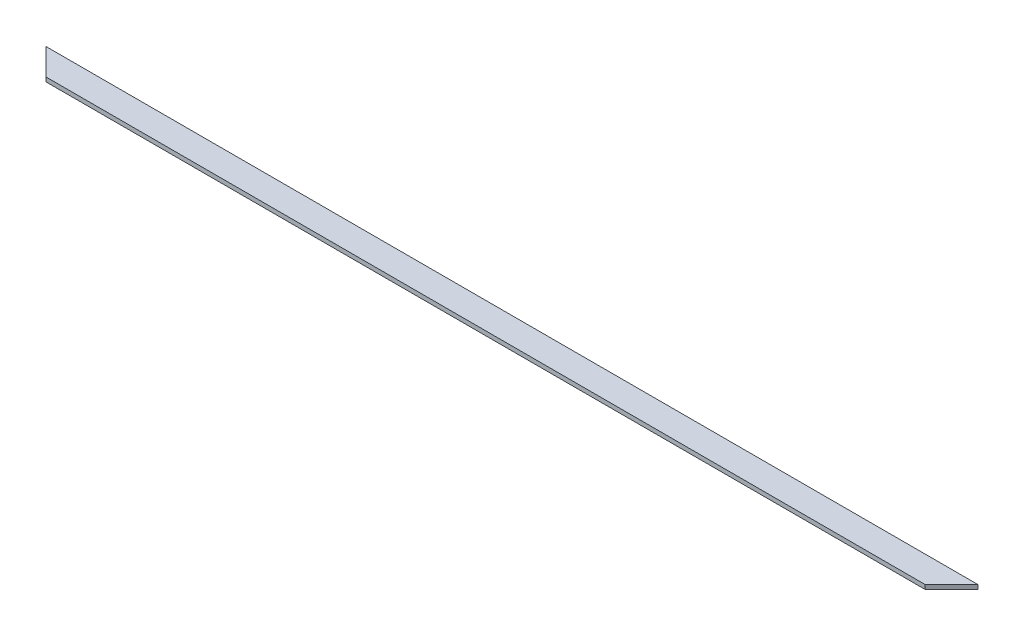
ISO-10303-21;
HEADER;
FILE_DESCRIPTION(('STEP AP214'),'2;1');
FILE_NAME('part.step','',(''),(''),'','','');
FILE_SCHEMA(('AUTOMOTIVE_DESIGN { 1 0 10303 214 1 1 1 1 }'));
ENDSEC;
DATA;
#1=APPLICATION_CONTEXT('core data for automotive mechanical design processes');
#2=APPLICATION_PROTOCOL_DEFINITION('international standard','automotive_design',2000,#1);
#3=PRODUCT_CONTEXT('',#1,'mechanical');
#4=PRODUCT('Part','Part','',(#3));
#5=PRODUCT_RELATED_PRODUCT_CATEGORY('part','',(#4));
#6=PRODUCT_DEFINITION_FORMATION('','',#4);
#7=PRODUCT_DEFINITION_CONTEXT('part definition',#1,'design');
#8=PRODUCT_DEFINITION('design','',#6,#7);
#9=PRODUCT_DEFINITION_SHAPE('','',#8);
#10=(LENGTH_UNIT() NAMED_UNIT(*) SI_UNIT(.MILLI.,.METRE.));
#11=(NAMED_UNIT(*) PLANE_ANGLE_UNIT() SI_UNIT($,.RADIAN.));
#12=(NAMED_UNIT(*) SI_UNIT($,.STERADIAN.) SOLID_ANGLE_UNIT());
#13=UNCERTAINTY_MEASURE_WITH_UNIT(LENGTH_MEASURE(1.E-05),#10,'distance_accuracy_value','');
#14=(GEOMETRIC_REPRESENTATION_CONTEXT(3) GLOBAL_UNCERTAINTY_ASSIGNED_CONTEXT((#13)) GLOBAL_UNIT_ASSIGNED_CONTEXT((#10,
#11,#12)) REPRESENTATION_CONTEXT('',''));
#15=CARTESIAN_POINT('',(0.,0.,0.));
#16=DIRECTION('',(0.,0.,1.));
#17=DIRECTION('',(1.,0.,0.));
#18=AXIS2_PLACEMENT_3D('',#15,#16,#17);
#19=CARTESIAN_POINT('',(-1481.85025510204,21.59,-921.397959183673));
#20=DIRECTION('',(0.707106781186548,0.,-0.707106781186548));
#21=DIRECTION('',(-0.707106781186548,0.,-0.707106781186548));
#22=AXIS2_PLACEMENT_3D('',#19,#20,#21);
#23=PLANE('',#22);
#24=DIRECTION('',(0.707106781186548,0.,0.707106781186548));
#25=VECTOR('',#24,1.);
#26=CARTESIAN_POINT('',(-1481.85025510204,0.,-921.397959183673));
#27=LINE('',#26,#25);
#28=CARTESIAN_POINT('',(-1481.85025510204,0.,-921.397959183673));
#29=VERTEX_POINT('',#28);
#30=CARTESIAN_POINT('',(-1348.50025510204,0.,-788.047959183673));
#31=VERTEX_POINT('',#30);
#32=EDGE_CURVE('E95',#29,#31,#27,.T.);
#33=ORIENTED_EDGE('',*,*,#32,.T.);
#34=DIRECTION('',(0.,-1.,0.));
#35=VECTOR('',#34,1.);
#36=CARTESIAN_POINT('',(-1348.50025510204,21.59,-788.047959183673));
#37=LINE('',#36,#35);
#38=CARTESIAN_POINT('',(-1348.50025510204,21.59,-788.047959183673));
#39=VERTEX_POINT('',#38);
#40=EDGE_CURVE('E11',#39,#31,#37,.T.);
#41=ORIENTED_EDGE('',*,*,#40,.F.);
#42=DIRECTION('',(0.707106781186548,0.,0.707106781186548));
#43=VECTOR('',#42,1.);
#44=CARTESIAN_POINT('',(-1481.85025510204,21.59,-921.397959183673));
#45=LINE('',#44,#43);
#46=CARTESIAN_POINT('',(-1481.85025510204,21.59,-921.397959183673));
#47=VERTEX_POINT('',#46);
#48=EDGE_CURVE('E81',#47,#39,#45,.T.);
#49=ORIENTED_EDGE('',*,*,#48,.F.);
#50=DIRECTION('',(0.,-1.,0.));
#51=VECTOR('',#50,1.);
#52=CARTESIAN_POINT('',(-1481.85025510204,21.59,-921.397959183673));
#53=LINE('',#52,#51);
#54=EDGE_CURVE('E48',#47,#29,#53,.T.);
#55=ORIENTED_EDGE('',*,*,#54,.T.);
#56=EDGE_LOOP('',(#33,#41,#49,#55));
#57=FACE_BOUND('',#56,.T.);
#58=ADVANCED_FACE('F32',(#57),#23,.F.);
#59=CARTESIAN_POINT('',(-1348.50025510204,21.59,-788.047959183673));
#60=DIRECTION('',(0.,0.,-1.));
#61=DIRECTION('',(-1.,0.,0.));
#62=AXIS2_PLACEMENT_3D('',#59,#60,#61);
#63=PLANE('',#62);
#64=DIRECTION('',(1.,0.,0.));
#65=VECTOR('',#64,1.);
#66=CARTESIAN_POINT('',(-1348.50025510204,0.,-788.047959183673));
#67=LINE('',#66,#65);
#68=CARTESIAN_POINT('',(3094.91224489796,0.,-788.047959183673));
#69=VERTEX_POINT('',#68);
#70=EDGE_CURVE('E86',#31,#69,#67,.T.);
#71=ORIENTED_EDGE('',*,*,#70,.T.);
#72=DIRECTION('',(0.,-1.,0.));
#73=VECTOR('',#72,1.);
#74=CARTESIAN_POINT('',(3094.91224489796,21.59,-788.047959183673));
#75=LINE('',#74,#73);
#76=CARTESIAN_POINT('',(3094.91224489796,21.59,-788.047959183673));
#77=VERTEX_POINT('',#76);
#78=EDGE_CURVE('E40',#77,#69,#75,.T.);
#79=ORIENTED_EDGE('',*,*,#78,.F.);
#80=DIRECTION('',(1.,0.,0.));
#81=VECTOR('',#80,1.);
#82=CARTESIAN_POINT('',(-1348.50025510204,21.59,-788.047959183673));
#83=LINE('',#82,#81);
#84=EDGE_CURVE('E73',#39,#77,#83,.T.);
#85=ORIENTED_EDGE('',*,*,#84,.F.);
#86=ORIENTED_EDGE('',*,*,#40,.T.);
#87=EDGE_LOOP('',(#71,#79,#85,#86));
#88=FACE_BOUND('',#87,.T.);
#89=ADVANCED_FACE('F85',(#88),#63,.F.);
#90=CARTESIAN_POINT('',(3228.26224489796,21.59,-921.397959183673));
#91=DIRECTION('',(0.707106781186548,0.,0.707106781186547));
#92=DIRECTION('',(0.707106781186547,0.,-0.707106781186548));
#93=AXIS2_PLACEMENT_3D('',#90,#91,#92);
#94=PLANE('',#93);
#95=DIRECTION('',(-0.707106781186547,0.,0.707106781186548));
#96=VECTOR('',#95,1.);
#97=CARTESIAN_POINT('',(3228.26224489796,0.,-921.397959183673));
#98=LINE('',#97,#96);
#99=CARTESIAN_POINT('',(3228.26224489796,0.,-921.397959183673));
#100=VERTEX_POINT('',#99);
#101=EDGE_CURVE('E98',#100,#69,#98,.T.);
#102=ORIENTED_EDGE('',*,*,#101,.F.);
#103=DIRECTION('',(0.,-1.,0.));
#104=VECTOR('',#103,1.);
#105=CARTESIAN_POINT('',(3228.26224489796,21.59,-921.397959183673));
#106=LINE('',#105,#104);
#107=CARTESIAN_POINT('',(3228.26224489796,21.59,-921.397959183673));
#108=VERTEX_POINT('',#107);
#109=EDGE_CURVE('E62',#108,#100,#106,.T.);
#110=ORIENTED_EDGE('',*,*,#109,.F.);
#111=DIRECTION('',(-0.707106781186547,0.,0.707106781186548));
#112=VECTOR('',#111,1.);
#113=CARTESIAN_POINT('',(3228.26224489796,21.59,-921.397959183673));
#114=LINE('',#113,#112);
#115=EDGE_CURVE('E80',#108,#77,#114,.T.);
#116=ORIENTED_EDGE('',*,*,#115,.T.);
#117=ORIENTED_EDGE('',*,*,#78,.T.);
#118=EDGE_LOOP('',(#102,#110,#116,#117));
#119=FACE_BOUND('',#118,.T.);
#120=ADVANCED_FACE('F89',(#119),#94,.T.);
#121=CARTESIAN_POINT('',(-1481.85025510204,21.59,-921.397959183673));
#122=DIRECTION('',(0.,0.,-1.));
#123=DIRECTION('',(-1.,0.,0.));
#124=AXIS2_PLACEMENT_3D('',#121,#122,#123);
#125=PLANE('',#124);
#126=DIRECTION('',(1.,0.,0.));
#127=VECTOR('',#126,1.);
#128=CARTESIAN_POINT('',(-1481.85025510204,0.,-921.397959183673));
#129=LINE('',#128,#127);
#130=EDGE_CURVE('E100',#29,#100,#129,.T.);
#131=ORIENTED_EDGE('',*,*,#130,.F.);
#132=ORIENTED_EDGE('',*,*,#54,.F.);
#133=DIRECTION('',(1.,0.,0.));
#134=VECTOR('',#133,1.);
#135=CARTESIAN_POINT('',(-1481.85025510204,21.59,-921.397959183673));
#136=LINE('',#135,#134);
#137=EDGE_CURVE('E90',#47,#108,#136,.T.);
#138=ORIENTED_EDGE('',*,*,#137,.T.);
#139=ORIENTED_EDGE('',*,*,#109,.T.);
#140=EDGE_LOOP('',(#131,#132,#138,#139));
#141=FACE_BOUND('',#140,.T.);
#142=ADVANCED_FACE('F106',(#141),#125,.T.);
#143=CARTESIAN_POINT('',(0.,21.59,0.));
#144=DIRECTION('',(0.,-1.,0.));
#145=DIRECTION('',(0.,0.,-1.));
#146=AXIS2_PLACEMENT_3D('',#143,#144,#145);
#147=PLANE('',#146);
#148=ORIENTED_EDGE('',*,*,#48,.T.);
#149=ORIENTED_EDGE('',*,*,#84,.T.);
#150=ORIENTED_EDGE('',*,*,#115,.F.);
#151=ORIENTED_EDGE('',*,*,#137,.F.);
#152=EDGE_LOOP('',(#148,#149,#150,#151));
#153=FACE_BOUND('',#152,.T.);
#154=ADVANCED_FACE('F77',(#153),#147,.F.);
#155=CARTESIAN_POINT('',(0.,0.,0.));
#156=DIRECTION('',(0.,-1.,0.));
#157=DIRECTION('',(0.,0.,-1.));
#158=AXIS2_PLACEMENT_3D('',#155,#156,#157);
#159=PLANE('',#158);
#160=ORIENTED_EDGE('',*,*,#32,.F.);
#161=ORIENTED_EDGE('',*,*,#130,.T.);
#162=ORIENTED_EDGE('',*,*,#101,.T.);
#163=ORIENTED_EDGE('',*,*,#70,.F.);
#164=EDGE_LOOP('',(#160,#161,#162,#163));
#165=FACE_BOUND('',#164,.T.);
#166=ADVANCED_FACE('F105',(#165),#159,.T.);
#167=CLOSED_SHELL('',(#58,#89,#120,#142,#154,#166));
#168=MANIFOLD_SOLID_BREP('B2',#167);
#169=ADVANCED_BREP_SHAPE_REPRESENTATION('',(#18,#168),#14);
#170=SHAPE_DEFINITION_REPRESENTATION(#9,#169);
ENDSEC;
END-ISO-10303-21;
